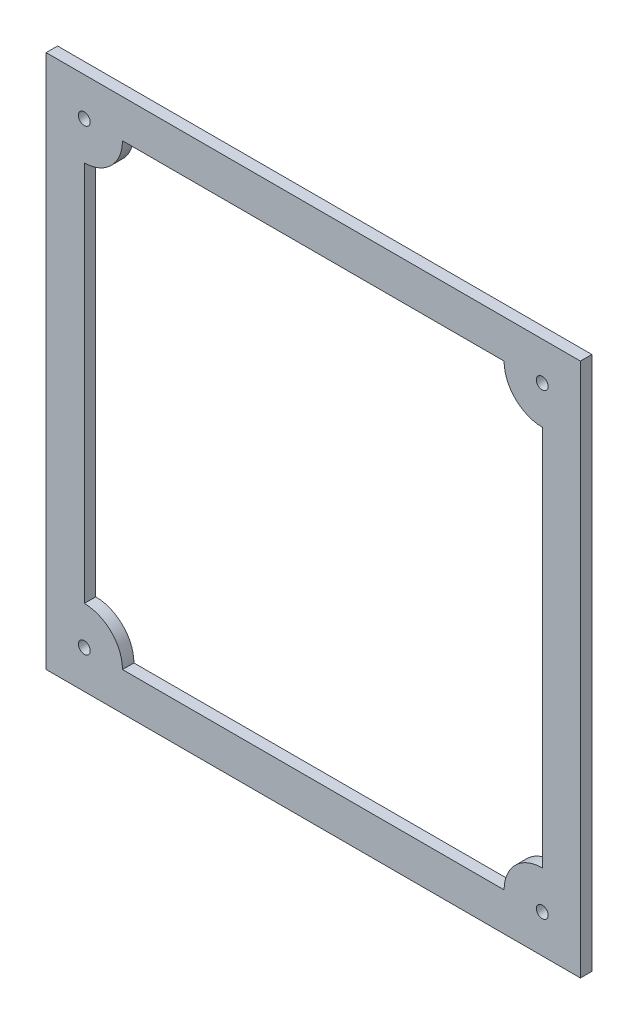
ISO-10303-21;
HEADER;
FILE_DESCRIPTION(('STEP AP214'),'2;1');
FILE_NAME('part.step','',(''),(''),'','','');
FILE_SCHEMA(('AUTOMOTIVE_DESIGN { 1 0 10303 214 1 1 1 1 }'));
ENDSEC;
DATA;
#1=APPLICATION_CONTEXT('core data for automotive mechanical design processes');
#2=APPLICATION_PROTOCOL_DEFINITION('international standard','automotive_design',2000,#1);
#3=PRODUCT_CONTEXT('',#1,'mechanical');
#4=PRODUCT('Part','Part','',(#3));
#5=PRODUCT_RELATED_PRODUCT_CATEGORY('part','',(#4));
#6=PRODUCT_DEFINITION_FORMATION('','',#4);
#7=PRODUCT_DEFINITION_CONTEXT('part definition',#1,'design');
#8=PRODUCT_DEFINITION('design','',#6,#7);
#9=PRODUCT_DEFINITION_SHAPE('','',#8);
#10=(LENGTH_UNIT() NAMED_UNIT(*) SI_UNIT(.MILLI.,.METRE.));
#11=(NAMED_UNIT(*) PLANE_ANGLE_UNIT() SI_UNIT($,.RADIAN.));
#12=(NAMED_UNIT(*) SI_UNIT($,.STERADIAN.) SOLID_ANGLE_UNIT());
#13=UNCERTAINTY_MEASURE_WITH_UNIT(LENGTH_MEASURE(1.E-05),#10,'distance_accuracy_value','');
#14=(GEOMETRIC_REPRESENTATION_CONTEXT(3) GLOBAL_UNCERTAINTY_ASSIGNED_CONTEXT((#13)) GLOBAL_UNIT_ASSIGNED_CONTEXT((#10,
#11,#12)) REPRESENTATION_CONTEXT('',''));
#15=CARTESIAN_POINT('',(0.,0.,0.));
#16=DIRECTION('',(0.,0.,1.));
#17=DIRECTION('',(1.,0.,0.));
#18=AXIS2_PLACEMENT_3D('',#15,#16,#17);
#19=CARTESIAN_POINT('',(0.,0.,3.));
#20=DIRECTION('',(0.,0.,-1.));
#21=DIRECTION('',(-1.,0.,0.));
#22=AXIS2_PLACEMENT_3D('',#19,#20,#21);
#23=PLANE('',#22);
#24=DIRECTION('',(0.,-1.,0.));
#25=VECTOR('',#24,1.);
#26=CARTESIAN_POINT('',(-60.,-50.,3.));
#27=LINE('',#26,#25);
#28=CARTESIAN_POINT('',(-60.,50.,3.));
#29=VERTEX_POINT('',#28);
#30=CARTESIAN_POINT('',(-60.,-50.,3.));
#31=VERTEX_POINT('',#30);
#32=EDGE_CURVE('E166',#29,#31,#27,.T.);
#33=ORIENTED_EDGE('',*,*,#32,.F.);
#34=CARTESIAN_POINT('',(-60.,60.,3.));
#35=DIRECTION('',(0.,0.,-1.));
#36=DIRECTION('',(1.,0.,0.));
#37=AXIS2_PLACEMENT_3D('',#34,#35,#36);
#38=CIRCLE('',#37,10.);
#39=CARTESIAN_POINT('',(-50.,60.,3.));
#40=VERTEX_POINT('',#39);
#41=EDGE_CURVE('E53',#40,#29,#38,.T.);
#42=ORIENTED_EDGE('',*,*,#41,.F.);
#43=DIRECTION('',(-1.,0.,0.));
#44=VECTOR('',#43,1.);
#45=CARTESIAN_POINT('',(-50.,60.,3.));
#46=LINE('',#45,#44);
#47=CARTESIAN_POINT('',(50.,60.,3.));
#48=VERTEX_POINT('',#47);
#49=EDGE_CURVE('E146',#48,#40,#46,.T.);
#50=ORIENTED_EDGE('',*,*,#49,.F.);
#51=CARTESIAN_POINT('',(60.,60.,3.));
#52=DIRECTION('',(0.,0.,-1.));
#53=DIRECTION('',(1.,0.,0.));
#54=AXIS2_PLACEMENT_3D('',#51,#52,#53);
#55=CIRCLE('',#54,10.);
#56=CARTESIAN_POINT('',(60.,50.,3.));
#57=VERTEX_POINT('',#56);
#58=EDGE_CURVE('E149',#57,#48,#55,.T.);
#59=ORIENTED_EDGE('',*,*,#58,.F.);
#60=DIRECTION('',(0.,1.,0.));
#61=VECTOR('',#60,1.);
#62=CARTESIAN_POINT('',(60.,-50.,3.));
#63=LINE('',#62,#61);
#64=CARTESIAN_POINT('',(60.,-50.,3.));
#65=VERTEX_POINT('',#64);
#66=EDGE_CURVE('E177',#65,#57,#63,.T.);
#67=ORIENTED_EDGE('',*,*,#66,.F.);
#68=CARTESIAN_POINT('',(60.,-60.,3.));
#69=DIRECTION('',(0.,0.,-1.));
#70=DIRECTION('',(1.,0.,0.));
#71=AXIS2_PLACEMENT_3D('',#68,#69,#70);
#72=CIRCLE('',#71,10.);
#73=CARTESIAN_POINT('',(50.,-60.,3.));
#74=VERTEX_POINT('',#73);
#75=EDGE_CURVE('E174',#74,#65,#72,.T.);
#76=ORIENTED_EDGE('',*,*,#75,.F.);
#77=DIRECTION('',(1.,0.,0.));
#78=VECTOR('',#77,1.);
#79=CARTESIAN_POINT('',(-50.,-60.,3.));
#80=LINE('',#79,#78);
#81=CARTESIAN_POINT('',(-50.,-60.,3.));
#82=VERTEX_POINT('',#81);
#83=EDGE_CURVE('E171',#82,#74,#80,.T.);
#84=ORIENTED_EDGE('',*,*,#83,.F.);
#85=CARTESIAN_POINT('',(-60.,-60.,3.));
#86=DIRECTION('',(0.,0.,-1.));
#87=DIRECTION('',(1.,0.,0.));
#88=AXIS2_PLACEMENT_3D('',#85,#86,#87);
#89=CIRCLE('',#88,10.);
#90=EDGE_CURVE('E168',#31,#82,#89,.T.);
#91=ORIENTED_EDGE('',*,*,#90,.F.);
#92=EDGE_LOOP('',(#33,#42,#50,#59,#67,#76,#84,#91));
#93=FACE_BOUND('',#92,.T.);
#94=DIRECTION('',(0.,1.,0.));
#95=VECTOR('',#94,1.);
#96=CARTESIAN_POINT('',(70.,-70.,3.));
#97=LINE('',#96,#95);
#98=CARTESIAN_POINT('',(70.,-70.,3.));
#99=VERTEX_POINT('',#98);
#100=CARTESIAN_POINT('',(70.,70.,3.));
#101=VERTEX_POINT('',#100);
#102=EDGE_CURVE('E220',#99,#101,#97,.T.);
#103=ORIENTED_EDGE('',*,*,#102,.T.);
#104=DIRECTION('',(-1.,0.,0.));
#105=VECTOR('',#104,1.);
#106=CARTESIAN_POINT('',(-70.,70.,3.));
#107=LINE('',#106,#105);
#108=CARTESIAN_POINT('',(-70.,70.,3.));
#109=VERTEX_POINT('',#108);
#110=EDGE_CURVE('E223',#101,#109,#107,.T.);
#111=ORIENTED_EDGE('',*,*,#110,.T.);
#112=DIRECTION('',(0.,-1.,0.));
#113=VECTOR('',#112,1.);
#114=CARTESIAN_POINT('',(-70.,-70.,3.));
#115=LINE('',#114,#113);
#116=CARTESIAN_POINT('',(-70.,-70.,3.));
#117=VERTEX_POINT('',#116);
#118=EDGE_CURVE('E226',#109,#117,#115,.T.);
#119=ORIENTED_EDGE('',*,*,#118,.T.);
#120=DIRECTION('',(1.,0.,0.));
#121=VECTOR('',#120,1.);
#122=CARTESIAN_POINT('',(-70.,-70.,3.));
#123=LINE('',#122,#121);
#124=EDGE_CURVE('E228',#117,#99,#123,.T.);
#125=ORIENTED_EDGE('',*,*,#124,.T.);
#126=EDGE_LOOP('',(#103,#111,#119,#125));
#127=FACE_BOUND('',#126,.T.);
#128=CARTESIAN_POINT('',(-60.,60.,3.));
#129=DIRECTION('',(0.,0.,1.));
#130=DIRECTION('',(1.,0.,0.));
#131=AXIS2_PLACEMENT_3D('',#128,#129,#130);
#132=CIRCLE('',#131,1.55);
#133=CARTESIAN_POINT('',(-58.45,60.,3.));
#134=VERTEX_POINT('',#133);
#135=EDGE_CURVE('E214',#134,#134,#132,.T.);
#136=ORIENTED_EDGE('',*,*,#135,.F.);
#137=EDGE_LOOP('',(#136));
#138=FACE_BOUND('',#137,.T.);
#139=CARTESIAN_POINT('',(60.,60.,3.));
#140=DIRECTION('',(0.,0.,1.));
#141=DIRECTION('',(1.,0.,0.));
#142=AXIS2_PLACEMENT_3D('',#139,#140,#141);
#143=CIRCLE('',#142,1.55);
#144=CARTESIAN_POINT('',(61.55,60.,3.));
#145=VERTEX_POINT('',#144);
#146=EDGE_CURVE('E208',#145,#145,#143,.T.);
#147=ORIENTED_EDGE('',*,*,#146,.F.);
#148=EDGE_LOOP('',(#147));
#149=FACE_BOUND('',#148,.T.);
#150=CARTESIAN_POINT('',(60.,-60.,3.));
#151=DIRECTION('',(0.,0.,1.));
#152=DIRECTION('',(1.,0.,0.));
#153=AXIS2_PLACEMENT_3D('',#150,#151,#152);
#154=CIRCLE('',#153,1.55);
#155=CARTESIAN_POINT('',(61.55,-60.,3.));
#156=VERTEX_POINT('',#155);
#157=EDGE_CURVE('E202',#156,#156,#154,.T.);
#158=ORIENTED_EDGE('',*,*,#157,.F.);
#159=EDGE_LOOP('',(#158));
#160=FACE_BOUND('',#159,.T.);
#161=CARTESIAN_POINT('',(-60.,-60.,3.));
#162=DIRECTION('',(0.,0.,1.));
#163=DIRECTION('',(1.,0.,0.));
#164=AXIS2_PLACEMENT_3D('',#161,#162,#163);
#165=CIRCLE('',#164,1.55);
#166=CARTESIAN_POINT('',(-58.45,-60.,3.));
#167=VERTEX_POINT('',#166);
#168=EDGE_CURVE('E196',#167,#167,#165,.T.);
#169=ORIENTED_EDGE('',*,*,#168,.F.);
#170=EDGE_LOOP('',(#169));
#171=FACE_BOUND('',#170,.T.);
#172=ADVANCED_FACE('F38',(#93,#127,#138,#149,#160,#171),#23,.F.);
#173=CARTESIAN_POINT('',(0.,0.,0.));
#174=DIRECTION('',(0.,0.,-1.));
#175=DIRECTION('',(-1.,0.,0.));
#176=AXIS2_PLACEMENT_3D('',#173,#174,#175);
#177=PLANE('',#176);
#178=CARTESIAN_POINT('',(-60.,60.,0.));
#179=DIRECTION('',(0.,0.,-1.));
#180=DIRECTION('',(1.,0.,0.));
#181=AXIS2_PLACEMENT_3D('',#178,#179,#180);
#182=CIRCLE('',#181,10.);
#183=CARTESIAN_POINT('',(-50.,60.,0.));
#184=VERTEX_POINT('',#183);
#185=CARTESIAN_POINT('',(-60.,50.,0.));
#186=VERTEX_POINT('',#185);
#187=EDGE_CURVE('E129',#184,#186,#182,.T.);
#188=ORIENTED_EDGE('',*,*,#187,.T.);
#189=DIRECTION('',(0.,-1.,0.));
#190=VECTOR('',#189,1.);
#191=CARTESIAN_POINT('',(-60.,-50.,0.));
#192=LINE('',#191,#190);
#193=CARTESIAN_POINT('',(-60.,-50.,0.));
#194=VERTEX_POINT('',#193);
#195=EDGE_CURVE('E138',#186,#194,#192,.T.);
#196=ORIENTED_EDGE('',*,*,#195,.T.);
#197=CARTESIAN_POINT('',(-60.,-60.,0.));
#198=DIRECTION('',(0.,0.,-1.));
#199=DIRECTION('',(1.,0.,0.));
#200=AXIS2_PLACEMENT_3D('',#197,#198,#199);
#201=CIRCLE('',#200,10.);
#202=CARTESIAN_POINT('',(-50.,-60.,0.));
#203=VERTEX_POINT('',#202);
#204=EDGE_CURVE('E61',#194,#203,#201,.T.);
#205=ORIENTED_EDGE('',*,*,#204,.T.);
#206=DIRECTION('',(1.,0.,0.));
#207=VECTOR('',#206,1.);
#208=CARTESIAN_POINT('',(-50.,-60.,0.));
#209=LINE('',#208,#207);
#210=CARTESIAN_POINT('',(50.,-60.,0.));
#211=VERTEX_POINT('',#210);
#212=EDGE_CURVE('E153',#203,#211,#209,.T.);
#213=ORIENTED_EDGE('',*,*,#212,.T.);
#214=CARTESIAN_POINT('',(60.,-60.,0.));
#215=DIRECTION('',(0.,0.,-1.));
#216=DIRECTION('',(1.,0.,0.));
#217=AXIS2_PLACEMENT_3D('',#214,#215,#216);
#218=CIRCLE('',#217,10.);
#219=CARTESIAN_POINT('',(60.,-50.,0.));
#220=VERTEX_POINT('',#219);
#221=EDGE_CURVE('E156',#211,#220,#218,.T.);
#222=ORIENTED_EDGE('',*,*,#221,.T.);
#223=DIRECTION('',(0.,1.,0.));
#224=VECTOR('',#223,1.);
#225=CARTESIAN_POINT('',(60.,-50.,0.));
#226=LINE('',#225,#224);
#227=CARTESIAN_POINT('',(60.,50.,0.));
#228=VERTEX_POINT('',#227);
#229=EDGE_CURVE('E159',#220,#228,#226,.T.);
#230=ORIENTED_EDGE('',*,*,#229,.T.);
#231=CARTESIAN_POINT('',(60.,60.,0.));
#232=DIRECTION('',(0.,0.,-1.));
#233=DIRECTION('',(1.,0.,0.));
#234=AXIS2_PLACEMENT_3D('',#231,#232,#233);
#235=CIRCLE('',#234,10.);
#236=CARTESIAN_POINT('',(50.,60.,0.));
#237=VERTEX_POINT('',#236);
#238=EDGE_CURVE('E162',#228,#237,#235,.T.);
#239=ORIENTED_EDGE('',*,*,#238,.T.);
#240=DIRECTION('',(-1.,0.,0.));
#241=VECTOR('',#240,1.);
#242=CARTESIAN_POINT('',(-50.,60.,0.));
#243=LINE('',#242,#241);
#244=EDGE_CURVE('E135',#237,#184,#243,.T.);
#245=ORIENTED_EDGE('',*,*,#244,.T.);
#246=EDGE_LOOP('',(#188,#196,#205,#213,#222,#230,#239,#245));
#247=FACE_BOUND('',#246,.T.);
#248=CARTESIAN_POINT('',(60.,-60.,0.));
#249=DIRECTION('',(0.,0.,1.));
#250=DIRECTION('',(1.,0.,0.));
#251=AXIS2_PLACEMENT_3D('',#248,#249,#250);
#252=CIRCLE('',#251,1.55);
#253=CARTESIAN_POINT('',(61.55,-60.,0.));
#254=VERTEX_POINT('',#253);
#255=EDGE_CURVE('E199',#254,#254,#252,.T.);
#256=ORIENTED_EDGE('',*,*,#255,.T.);
#257=EDGE_LOOP('',(#256));
#258=FACE_BOUND('',#257,.T.);
#259=CARTESIAN_POINT('',(-60.,60.,0.));
#260=DIRECTION('',(0.,0.,1.));
#261=DIRECTION('',(1.,0.,0.));
#262=AXIS2_PLACEMENT_3D('',#259,#260,#261);
#263=CIRCLE('',#262,1.55);
#264=CARTESIAN_POINT('',(-58.45,60.,0.));
#265=VERTEX_POINT('',#264);
#266=EDGE_CURVE('E211',#265,#265,#263,.T.);
#267=ORIENTED_EDGE('',*,*,#266,.T.);
#268=EDGE_LOOP('',(#267));
#269=FACE_BOUND('',#268,.T.);
#270=DIRECTION('',(0.,1.,0.));
#271=VECTOR('',#270,1.);
#272=CARTESIAN_POINT('',(70.,-70.,0.));
#273=LINE('',#272,#271);
#274=CARTESIAN_POINT('',(70.,-70.,0.));
#275=VERTEX_POINT('',#274);
#276=CARTESIAN_POINT('',(70.,70.,0.));
#277=VERTEX_POINT('',#276);
#278=EDGE_CURVE('E217',#275,#277,#273,.T.);
#279=ORIENTED_EDGE('',*,*,#278,.F.);
#280=DIRECTION('',(1.,0.,0.));
#281=VECTOR('',#280,1.);
#282=CARTESIAN_POINT('',(-70.,-70.,0.));
#283=LINE('',#282,#281);
#284=CARTESIAN_POINT('',(-70.,-70.,0.));
#285=VERTEX_POINT('',#284);
#286=EDGE_CURVE('E224',#285,#275,#283,.T.);
#287=ORIENTED_EDGE('',*,*,#286,.F.);
#288=DIRECTION('',(0.,-1.,0.));
#289=VECTOR('',#288,1.);
#290=CARTESIAN_POINT('',(-70.,-70.,0.));
#291=LINE('',#290,#289);
#292=CARTESIAN_POINT('',(-70.,70.,0.));
#293=VERTEX_POINT('',#292);
#294=EDGE_CURVE('E235',#293,#285,#291,.T.);
#295=ORIENTED_EDGE('',*,*,#294,.F.);
#296=DIRECTION('',(-1.,0.,0.));
#297=VECTOR('',#296,1.);
#298=CARTESIAN_POINT('',(-70.,70.,0.));
#299=LINE('',#298,#297);
#300=EDGE_CURVE('E233',#277,#293,#299,.T.);
#301=ORIENTED_EDGE('',*,*,#300,.F.);
#302=EDGE_LOOP('',(#279,#287,#295,#301));
#303=FACE_BOUND('',#302,.T.);
#304=CARTESIAN_POINT('',(60.,60.,0.));
#305=DIRECTION('',(0.,0.,1.));
#306=DIRECTION('',(1.,0.,0.));
#307=AXIS2_PLACEMENT_3D('',#304,#305,#306);
#308=CIRCLE('',#307,1.55);
#309=CARTESIAN_POINT('',(61.55,60.,0.));
#310=VERTEX_POINT('',#309);
#311=EDGE_CURVE('E205',#310,#310,#308,.T.);
#312=ORIENTED_EDGE('',*,*,#311,.T.);
#313=EDGE_LOOP('',(#312));
#314=FACE_BOUND('',#313,.T.);
#315=CARTESIAN_POINT('',(-60.,-60.,0.));
#316=DIRECTION('',(0.,0.,1.));
#317=DIRECTION('',(1.,0.,0.));
#318=AXIS2_PLACEMENT_3D('',#315,#316,#317);
#319=CIRCLE('',#318,1.55);
#320=CARTESIAN_POINT('',(-58.45,-60.,0.));
#321=VERTEX_POINT('',#320);
#322=EDGE_CURVE('E184',#321,#321,#319,.T.);
#323=ORIENTED_EDGE('',*,*,#322,.T.);
#324=EDGE_LOOP('',(#323));
#325=FACE_BOUND('',#324,.T.);
#326=ADVANCED_FACE('F142',(#247,#258,#269,#303,#314,#325),#177,.T.);
#327=CARTESIAN_POINT('',(70.,-70.,3.));
#328=DIRECTION('',(-1.,0.,0.));
#329=DIRECTION('',(0.,0.,1.));
#330=AXIS2_PLACEMENT_3D('',#327,#328,#329);
#331=PLANE('',#330);
#332=ORIENTED_EDGE('',*,*,#278,.T.);
#333=DIRECTION('',(0.,0.,-1.));
#334=VECTOR('',#333,1.);
#335=CARTESIAN_POINT('',(70.,70.,3.));
#336=LINE('',#335,#334);
#337=EDGE_CURVE('E11',#101,#277,#336,.T.);
#338=ORIENTED_EDGE('',*,*,#337,.F.);
#339=ORIENTED_EDGE('',*,*,#102,.F.);
#340=DIRECTION('',(0.,0.,-1.));
#341=VECTOR('',#340,1.);
#342=CARTESIAN_POINT('',(70.,-70.,3.));
#343=LINE('',#342,#341);
#344=EDGE_CURVE('E230',#99,#275,#343,.T.);
#345=ORIENTED_EDGE('',*,*,#344,.T.);
#346=EDGE_LOOP('',(#332,#338,#339,#345));
#347=FACE_BOUND('',#346,.T.);
#348=ADVANCED_FACE('F40',(#347),#331,.F.);
#349=CARTESIAN_POINT('',(-70.,70.,3.));
#350=DIRECTION('',(0.,-1.,0.));
#351=DIRECTION('',(0.,0.,-1.));
#352=AXIS2_PLACEMENT_3D('',#349,#350,#351);
#353=PLANE('',#352);
#354=ORIENTED_EDGE('',*,*,#300,.T.);
#355=DIRECTION('',(0.,0.,-1.));
#356=VECTOR('',#355,1.);
#357=CARTESIAN_POINT('',(-70.,70.,3.));
#358=LINE('',#357,#356);
#359=EDGE_CURVE('E46',#109,#293,#358,.T.);
#360=ORIENTED_EDGE('',*,*,#359,.F.);
#361=ORIENTED_EDGE('',*,*,#110,.F.);
#362=ORIENTED_EDGE('',*,*,#337,.T.);
#363=EDGE_LOOP('',(#354,#360,#361,#362));
#364=FACE_BOUND('',#363,.T.);
#365=ADVANCED_FACE('F263',(#364),#353,.F.);
#366=CARTESIAN_POINT('',(-70.,-70.,3.));
#367=DIRECTION('',(1.,0.,0.));
#368=DIRECTION('',(0.,0.,-1.));
#369=AXIS2_PLACEMENT_3D('',#366,#367,#368);
#370=PLANE('',#369);
#371=ORIENTED_EDGE('',*,*,#294,.T.);
#372=DIRECTION('',(0.,0.,-1.));
#373=VECTOR('',#372,1.);
#374=CARTESIAN_POINT('',(-70.,-70.,3.));
#375=LINE('',#374,#373);
#376=EDGE_CURVE('E240',#117,#285,#375,.T.);
#377=ORIENTED_EDGE('',*,*,#376,.F.);
#378=ORIENTED_EDGE('',*,*,#118,.F.);
#379=ORIENTED_EDGE('',*,*,#359,.T.);
#380=EDGE_LOOP('',(#371,#377,#378,#379));
#381=FACE_BOUND('',#380,.T.);
#382=ADVANCED_FACE('F247',(#381),#370,.F.);
#383=CARTESIAN_POINT('',(-70.,-70.,3.));
#384=DIRECTION('',(0.,1.,0.));
#385=DIRECTION('',(0.,0.,1.));
#386=AXIS2_PLACEMENT_3D('',#383,#384,#385);
#387=PLANE('',#386);
#388=ORIENTED_EDGE('',*,*,#286,.T.);
#389=ORIENTED_EDGE('',*,*,#344,.F.);
#390=ORIENTED_EDGE('',*,*,#124,.F.);
#391=ORIENTED_EDGE('',*,*,#376,.T.);
#392=EDGE_LOOP('',(#388,#389,#390,#391));
#393=FACE_BOUND('',#392,.T.);
#394=ADVANCED_FACE('F256',(#393),#387,.F.);
#395=CARTESIAN_POINT('',(-60.,60.,3.));
#396=DIRECTION('',(0.,0.,-1.));
#397=DIRECTION('',(-1.,0.,0.));
#398=AXIS2_PLACEMENT_3D('',#395,#396,#397);
#399=CYLINDRICAL_SURFACE('',#398,1.55);
#400=ORIENTED_EDGE('',*,*,#135,.T.);
#401=EDGE_LOOP('',(#400));
#402=FACE_BOUND('',#401,.T.);
#403=ORIENTED_EDGE('',*,*,#266,.F.);
#404=EDGE_LOOP('',(#403));
#405=FACE_BOUND('',#404,.T.);
#406=ADVANCED_FACE('F279',(#402,#405),#399,.F.);
#407=CARTESIAN_POINT('',(60.,60.,3.));
#408=DIRECTION('',(0.,0.,-1.));
#409=DIRECTION('',(-1.,0.,0.));
#410=AXIS2_PLACEMENT_3D('',#407,#408,#409);
#411=CYLINDRICAL_SURFACE('',#410,1.55);
#412=ORIENTED_EDGE('',*,*,#146,.T.);
#413=EDGE_LOOP('',(#412));
#414=FACE_BOUND('',#413,.T.);
#415=ORIENTED_EDGE('',*,*,#311,.F.);
#416=EDGE_LOOP('',(#415));
#417=FACE_BOUND('',#416,.T.);
#418=ADVANCED_FACE('F286',(#414,#417),#411,.F.);
#419=CARTESIAN_POINT('',(60.,-60.,3.));
#420=DIRECTION('',(0.,0.,-1.));
#421=DIRECTION('',(-1.,0.,0.));
#422=AXIS2_PLACEMENT_3D('',#419,#420,#421);
#423=CYLINDRICAL_SURFACE('',#422,1.55);
#424=ORIENTED_EDGE('',*,*,#157,.T.);
#425=EDGE_LOOP('',(#424));
#426=FACE_BOUND('',#425,.T.);
#427=ORIENTED_EDGE('',*,*,#255,.F.);
#428=EDGE_LOOP('',(#427));
#429=FACE_BOUND('',#428,.T.);
#430=ADVANCED_FACE('F291',(#426,#429),#423,.F.);
#431=CARTESIAN_POINT('',(-60.,-60.,3.));
#432=DIRECTION('',(0.,0.,-1.));
#433=DIRECTION('',(-1.,0.,0.));
#434=AXIS2_PLACEMENT_3D('',#431,#432,#433);
#435=CYLINDRICAL_SURFACE('',#434,1.55);
#436=ORIENTED_EDGE('',*,*,#168,.T.);
#437=EDGE_LOOP('',(#436));
#438=FACE_BOUND('',#437,.T.);
#439=ORIENTED_EDGE('',*,*,#322,.F.);
#440=EDGE_LOOP('',(#439));
#441=FACE_BOUND('',#440,.T.);
#442=ADVANCED_FACE('F304',(#438,#441),#435,.F.);
#443=CARTESIAN_POINT('',(-60.,60.,0.));
#444=DIRECTION('',(0.,0.,1.));
#445=DIRECTION('',(1.,0.,0.));
#446=AXIS2_PLACEMENT_3D('',#443,#444,#445);
#447=CYLINDRICAL_SURFACE('',#446,10.);
#448=ORIENTED_EDGE('',*,*,#41,.T.);
#449=DIRECTION('',(0.,0.,1.));
#450=VECTOR('',#449,1.);
#451=CARTESIAN_POINT('',(-60.,50.,0.));
#452=LINE('',#451,#450);
#453=EDGE_CURVE('E125',#186,#29,#452,.T.);
#454=ORIENTED_EDGE('',*,*,#453,.F.);
#455=ORIENTED_EDGE('',*,*,#187,.F.);
#456=DIRECTION('',(0.,0.,1.));
#457=VECTOR('',#456,1.);
#458=CARTESIAN_POINT('',(-50.,60.,0.));
#459=LINE('',#458,#457);
#460=EDGE_CURVE('E182',#184,#40,#459,.T.);
#461=ORIENTED_EDGE('',*,*,#460,.T.);
#462=EDGE_LOOP('',(#448,#454,#455,#461));
#463=FACE_BOUND('',#462,.T.);
#464=ADVANCED_FACE('F127',(#463),#447,.T.);
#465=CARTESIAN_POINT('',(-50.,60.,0.));
#466=DIRECTION('',(0.,1.,0.));
#467=DIRECTION('',(0.,0.,1.));
#468=AXIS2_PLACEMENT_3D('',#465,#466,#467);
#469=PLANE('',#468);
#470=ORIENTED_EDGE('',*,*,#49,.T.);
#471=ORIENTED_EDGE('',*,*,#460,.F.);
#472=ORIENTED_EDGE('',*,*,#244,.F.);
#473=DIRECTION('',(0.,0.,1.));
#474=VECTOR('',#473,1.);
#475=CARTESIAN_POINT('',(50.,60.,0.));
#476=LINE('',#475,#474);
#477=EDGE_CURVE('E185',#237,#48,#476,.T.);
#478=ORIENTED_EDGE('',*,*,#477,.T.);
#479=EDGE_LOOP('',(#470,#471,#472,#478));
#480=FACE_BOUND('',#479,.T.);
#481=ADVANCED_FACE('F313',(#480),#469,.F.);
#482=CARTESIAN_POINT('',(60.,60.,0.));
#483=DIRECTION('',(0.,0.,1.));
#484=DIRECTION('',(1.,0.,0.));
#485=AXIS2_PLACEMENT_3D('',#482,#483,#484);
#486=CYLINDRICAL_SURFACE('',#485,10.);
#487=ORIENTED_EDGE('',*,*,#58,.T.);
#488=ORIENTED_EDGE('',*,*,#477,.F.);
#489=ORIENTED_EDGE('',*,*,#238,.F.);
#490=DIRECTION('',(0.,0.,1.));
#491=VECTOR('',#490,1.);
#492=CARTESIAN_POINT('',(60.,50.,0.));
#493=LINE('',#492,#491);
#494=EDGE_CURVE('E187',#228,#57,#493,.T.);
#495=ORIENTED_EDGE('',*,*,#494,.T.);
#496=EDGE_LOOP('',(#487,#488,#489,#495));
#497=FACE_BOUND('',#496,.T.);
#498=ADVANCED_FACE('F334',(#497),#486,.T.);
#499=CARTESIAN_POINT('',(60.,-50.,0.));
#500=DIRECTION('',(1.,0.,0.));
#501=DIRECTION('',(0.,0.,-1.));
#502=AXIS2_PLACEMENT_3D('',#499,#500,#501);
#503=PLANE('',#502);
#504=ORIENTED_EDGE('',*,*,#66,.T.);
#505=ORIENTED_EDGE('',*,*,#494,.F.);
#506=ORIENTED_EDGE('',*,*,#229,.F.);
#507=DIRECTION('',(0.,0.,1.));
#508=VECTOR('',#507,1.);
#509=CARTESIAN_POINT('',(60.,-50.,0.));
#510=LINE('',#509,#508);
#511=EDGE_CURVE('E189',#220,#65,#510,.T.);
#512=ORIENTED_EDGE('',*,*,#511,.T.);
#513=EDGE_LOOP('',(#504,#505,#506,#512));
#514=FACE_BOUND('',#513,.T.);
#515=ADVANCED_FACE('F330',(#514),#503,.F.);
#516=CARTESIAN_POINT('',(60.,-60.,0.));
#517=DIRECTION('',(0.,0.,1.));
#518=DIRECTION('',(1.,0.,0.));
#519=AXIS2_PLACEMENT_3D('',#516,#517,#518);
#520=CYLINDRICAL_SURFACE('',#519,10.);
#521=ORIENTED_EDGE('',*,*,#75,.T.);
#522=ORIENTED_EDGE('',*,*,#511,.F.);
#523=ORIENTED_EDGE('',*,*,#221,.F.);
#524=DIRECTION('',(0.,0.,1.));
#525=VECTOR('',#524,1.);
#526=CARTESIAN_POINT('',(50.,-60.,0.));
#527=LINE('',#526,#525);
#528=EDGE_CURVE('E191',#211,#74,#527,.T.);
#529=ORIENTED_EDGE('',*,*,#528,.T.);
#530=EDGE_LOOP('',(#521,#522,#523,#529));
#531=FACE_BOUND('',#530,.T.);
#532=ADVANCED_FACE('F326',(#531),#520,.T.);
#533=CARTESIAN_POINT('',(-50.,-60.,0.));
#534=DIRECTION('',(0.,-1.,0.));
#535=DIRECTION('',(0.,0.,-1.));
#536=AXIS2_PLACEMENT_3D('',#533,#534,#535);
#537=PLANE('',#536);
#538=ORIENTED_EDGE('',*,*,#83,.T.);
#539=ORIENTED_EDGE('',*,*,#528,.F.);
#540=ORIENTED_EDGE('',*,*,#212,.F.);
#541=DIRECTION('',(0.,0.,1.));
#542=VECTOR('',#541,1.);
#543=CARTESIAN_POINT('',(-50.,-60.,0.));
#544=LINE('',#543,#542);
#545=EDGE_CURVE('E193',#203,#82,#544,.T.);
#546=ORIENTED_EDGE('',*,*,#545,.T.);
#547=EDGE_LOOP('',(#538,#539,#540,#546));
#548=FACE_BOUND('',#547,.T.);
#549=ADVANCED_FACE('F323',(#548),#537,.F.);
#550=CARTESIAN_POINT('',(-60.,-60.,0.));
#551=DIRECTION('',(0.,0.,1.));
#552=DIRECTION('',(1.,0.,0.));
#553=AXIS2_PLACEMENT_3D('',#550,#551,#552);
#554=CYLINDRICAL_SURFACE('',#553,10.);
#555=ORIENTED_EDGE('',*,*,#90,.T.);
#556=ORIENTED_EDGE('',*,*,#545,.F.);
#557=ORIENTED_EDGE('',*,*,#204,.F.);
#558=DIRECTION('',(0.,0.,1.));
#559=VECTOR('',#558,1.);
#560=CARTESIAN_POINT('',(-60.,-50.,0.));
#561=LINE('',#560,#559);
#562=EDGE_CURVE('E134',#194,#31,#561,.T.);
#563=ORIENTED_EDGE('',*,*,#562,.T.);
#564=EDGE_LOOP('',(#555,#556,#557,#563));
#565=FACE_BOUND('',#564,.T.);
#566=ADVANCED_FACE('F320',(#565),#554,.T.);
#567=CARTESIAN_POINT('',(-60.,-50.,0.));
#568=DIRECTION('',(-1.,0.,0.));
#569=DIRECTION('',(0.,0.,1.));
#570=AXIS2_PLACEMENT_3D('',#567,#568,#569);
#571=PLANE('',#570);
#572=ORIENTED_EDGE('',*,*,#32,.T.);
#573=ORIENTED_EDGE('',*,*,#562,.F.);
#574=ORIENTED_EDGE('',*,*,#195,.F.);
#575=ORIENTED_EDGE('',*,*,#453,.T.);
#576=EDGE_LOOP('',(#572,#573,#574,#575));
#577=FACE_BOUND('',#576,.T.);
#578=ADVANCED_FACE('F139',(#577),#571,.F.);
#579=CLOSED_SHELL('',(#172,#326,#348,#365,#382,#394,#406,#418,#430,#442,#464,#481,#498,#515,
#532,#549,#566,#578));
#580=MANIFOLD_SOLID_BREP('B2',#579);
#581=ADVANCED_BREP_SHAPE_REPRESENTATION('',(#18,#580),#14);
#582=SHAPE_DEFINITION_REPRESENTATION(#9,#581);
ENDSEC;
END-ISO-10303-21;
